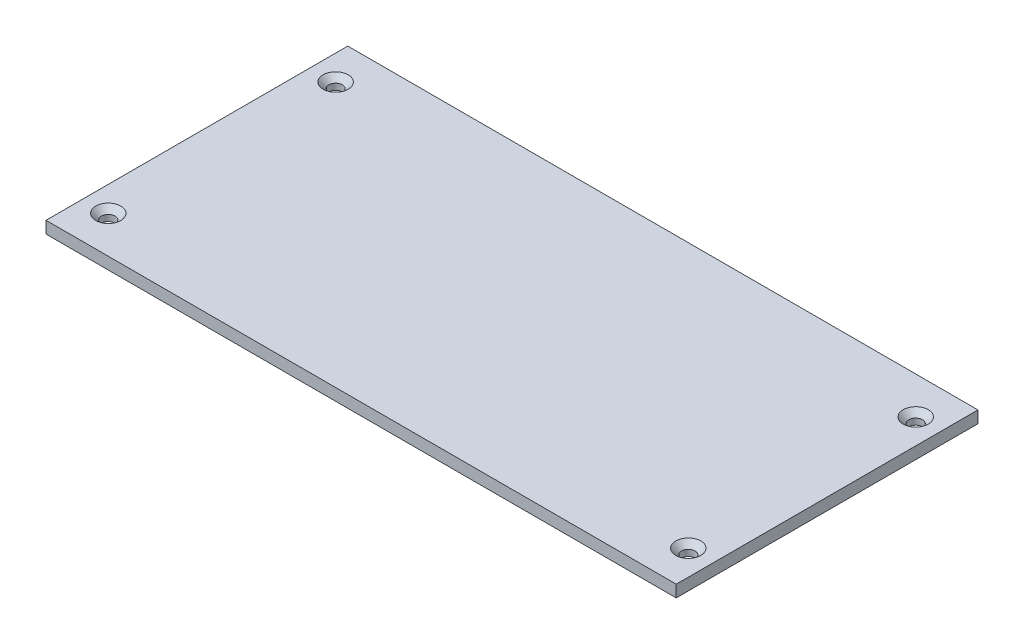
ISO-10303-21;
HEADER;
FILE_DESCRIPTION(('STEP AP214'),'2;1');
FILE_NAME('part.step','',(''),(''),'','','');
FILE_SCHEMA(('AUTOMOTIVE_DESIGN { 1 0 10303 214 1 1 1 1 }'));
ENDSEC;
DATA;
#1=APPLICATION_CONTEXT('core data for automotive mechanical design processes');
#2=APPLICATION_PROTOCOL_DEFINITION('international standard','automotive_design',2000,#1);
#3=PRODUCT_CONTEXT('',#1,'mechanical');
#4=PRODUCT('Part','Part','',(#3));
#5=PRODUCT_RELATED_PRODUCT_CATEGORY('part','',(#4));
#6=PRODUCT_DEFINITION_FORMATION('','',#4);
#7=PRODUCT_DEFINITION_CONTEXT('part definition',#1,'design');
#8=PRODUCT_DEFINITION('design','',#6,#7);
#9=PRODUCT_DEFINITION_SHAPE('','',#8);
#10=(LENGTH_UNIT() NAMED_UNIT(*) SI_UNIT(.MILLI.,.METRE.));
#11=(NAMED_UNIT(*) PLANE_ANGLE_UNIT() SI_UNIT($,.RADIAN.));
#12=(NAMED_UNIT(*) SI_UNIT($,.STERADIAN.) SOLID_ANGLE_UNIT());
#13=UNCERTAINTY_MEASURE_WITH_UNIT(LENGTH_MEASURE(1.E-05),#10,'distance_accuracy_value','');
#14=(GEOMETRIC_REPRESENTATION_CONTEXT(3) GLOBAL_UNCERTAINTY_ASSIGNED_CONTEXT((#13)) GLOBAL_UNIT_ASSIGNED_CONTEXT((#10,
#11,#12)) REPRESENTATION_CONTEXT('',''));
#15=CARTESIAN_POINT('',(0.,0.,0.));
#16=DIRECTION('',(0.,0.,1.));
#17=DIRECTION('',(1.,0.,0.));
#18=AXIS2_PLACEMENT_3D('',#15,#16,#17);
#19=CARTESIAN_POINT('',(-79.200000096,3.,37.925000096));
#20=DIRECTION('',(0.,0.,-1.));
#21=DIRECTION('',(-1.,0.,0.));
#22=AXIS2_PLACEMENT_3D('',#19,#20,#21);
#23=PLANE('',#22);
#24=DIRECTION('',(1.,0.,0.));
#25=VECTOR('',#24,1.);
#26=CARTESIAN_POINT('',(-79.200000096,0.,37.925000096));
#27=LINE('',#26,#25);
#28=CARTESIAN_POINT('',(-79.200000096,0.,37.925000096));
#29=VERTEX_POINT('',#28);
#30=CARTESIAN_POINT('',(79.200000096,0.,37.925000096));
#31=VERTEX_POINT('',#30);
#32=EDGE_CURVE('E107',#29,#31,#27,.T.);
#33=ORIENTED_EDGE('',*,*,#32,.T.);
#34=DIRECTION('',(0.,-1.,0.));
#35=VECTOR('',#34,1.);
#36=CARTESIAN_POINT('',(79.200000096,3.,37.925000096));
#37=LINE('',#36,#35);
#38=CARTESIAN_POINT('',(79.200000096,3.,37.925000096));
#39=VERTEX_POINT('',#38);
#40=EDGE_CURVE('E11',#39,#31,#37,.T.);
#41=ORIENTED_EDGE('',*,*,#40,.F.);
#42=DIRECTION('',(1.,0.,0.));
#43=VECTOR('',#42,1.);
#44=CARTESIAN_POINT('',(-79.200000096,3.,37.925000096));
#45=LINE('',#44,#43);
#46=CARTESIAN_POINT('',(-79.200000096,3.,37.925000096));
#47=VERTEX_POINT('',#46);
#48=EDGE_CURVE('E89',#47,#39,#45,.T.);
#49=ORIENTED_EDGE('',*,*,#48,.F.);
#50=DIRECTION('',(0.,-1.,0.));
#51=VECTOR('',#50,1.);
#52=CARTESIAN_POINT('',(-79.200000096,3.,37.925000096));
#53=LINE('',#52,#51);
#54=EDGE_CURVE('E56',#47,#29,#53,.T.);
#55=ORIENTED_EDGE('',*,*,#54,.T.);
#56=EDGE_LOOP('',(#33,#41,#49,#55));
#57=FACE_BOUND('',#56,.T.);
#58=ADVANCED_FACE('F39',(#57),#23,.F.);
#59=CARTESIAN_POINT('',(79.200000096,3.,37.925000096));
#60=DIRECTION('',(-1.,0.,0.));
#61=DIRECTION('',(0.,0.,1.));
#62=AXIS2_PLACEMENT_3D('',#59,#60,#61);
#63=PLANE('',#62);
#64=DIRECTION('',(0.,0.,-1.));
#65=VECTOR('',#64,1.);
#66=CARTESIAN_POINT('',(79.200000096,0.,37.925000096));
#67=LINE('',#66,#65);
#68=CARTESIAN_POINT('',(79.200000096,0.,-37.925000096));
#69=VERTEX_POINT('',#68);
#70=EDGE_CURVE('E95',#31,#69,#67,.T.);
#71=ORIENTED_EDGE('',*,*,#70,.T.);
#72=DIRECTION('',(0.,-1.,0.));
#73=VECTOR('',#72,1.);
#74=CARTESIAN_POINT('',(79.200000096,3.,-37.925000096));
#75=LINE('',#74,#73);
#76=CARTESIAN_POINT('',(79.200000096,3.,-37.925000096));
#77=VERTEX_POINT('',#76);
#78=EDGE_CURVE('E48',#77,#69,#75,.T.);
#79=ORIENTED_EDGE('',*,*,#78,.F.);
#80=DIRECTION('',(0.,0.,-1.));
#81=VECTOR('',#80,1.);
#82=CARTESIAN_POINT('',(79.200000096,3.,37.925000096));
#83=LINE('',#82,#81);
#84=EDGE_CURVE('E81',#39,#77,#83,.T.);
#85=ORIENTED_EDGE('',*,*,#84,.F.);
#86=ORIENTED_EDGE('',*,*,#40,.T.);
#87=EDGE_LOOP('',(#71,#79,#85,#86));
#88=FACE_BOUND('',#87,.T.);
#89=ADVANCED_FACE('F94',(#88),#63,.F.);
#90=CARTESIAN_POINT('',(-79.200000096,3.,-37.925000096));
#91=DIRECTION('',(0.,0.,-1.));
#92=DIRECTION('',(-1.,0.,0.));
#93=AXIS2_PLACEMENT_3D('',#90,#91,#92);
#94=PLANE('',#93);
#95=DIRECTION('',(1.,0.,0.));
#96=VECTOR('',#95,1.);
#97=CARTESIAN_POINT('',(-79.200000096,0.,-37.925000096));
#98=LINE('',#97,#96);
#99=CARTESIAN_POINT('',(-79.200000096,0.,-37.925000096));
#100=VERTEX_POINT('',#99);
#101=EDGE_CURVE('E113',#100,#69,#98,.T.);
#102=ORIENTED_EDGE('',*,*,#101,.F.);
#103=DIRECTION('',(0.,-1.,0.));
#104=VECTOR('',#103,1.);
#105=CARTESIAN_POINT('',(-79.200000096,3.,-37.925000096));
#106=LINE('',#105,#104);
#107=CARTESIAN_POINT('',(-79.200000096,3.,-37.925000096));
#108=VERTEX_POINT('',#107);
#109=EDGE_CURVE('E70',#108,#100,#106,.T.);
#110=ORIENTED_EDGE('',*,*,#109,.F.);
#111=DIRECTION('',(1.,0.,0.));
#112=VECTOR('',#111,1.);
#113=CARTESIAN_POINT('',(-79.200000096,3.,-37.925000096));
#114=LINE('',#113,#112);
#115=EDGE_CURVE('E88',#108,#77,#114,.T.);
#116=ORIENTED_EDGE('',*,*,#115,.T.);
#117=ORIENTED_EDGE('',*,*,#78,.T.);
#118=EDGE_LOOP('',(#102,#110,#116,#117));
#119=FACE_BOUND('',#118,.T.);
#120=ADVANCED_FACE('F99',(#119),#94,.T.);
#121=CARTESIAN_POINT('',(-79.200000096,3.,37.925000096));
#122=DIRECTION('',(-1.,0.,0.));
#123=DIRECTION('',(0.,0.,1.));
#124=AXIS2_PLACEMENT_3D('',#121,#122,#123);
#125=PLANE('',#124);
#126=DIRECTION('',(0.,0.,-1.));
#127=VECTOR('',#126,1.);
#128=CARTESIAN_POINT('',(-79.200000096,0.,37.925000096));
#129=LINE('',#128,#127);
#130=EDGE_CURVE('E116',#29,#100,#129,.T.);
#131=ORIENTED_EDGE('',*,*,#130,.F.);
#132=ORIENTED_EDGE('',*,*,#54,.F.);
#133=DIRECTION('',(0.,0.,-1.));
#134=VECTOR('',#133,1.);
#135=CARTESIAN_POINT('',(-79.200000096,3.,37.925000096));
#136=LINE('',#135,#134);
#137=EDGE_CURVE('E101',#47,#108,#136,.T.);
#138=ORIENTED_EDGE('',*,*,#137,.T.);
#139=ORIENTED_EDGE('',*,*,#109,.T.);
#140=EDGE_LOOP('',(#131,#132,#138,#139));
#141=FACE_BOUND('',#140,.T.);
#142=ADVANCED_FACE('F179',(#141),#125,.T.);
#143=CARTESIAN_POINT('',(0.,3.,0.));
#144=DIRECTION('',(0.,1.,0.));
#145=DIRECTION('',(0.,0.,1.));
#146=AXIS2_PLACEMENT_3D('',#143,#144,#145);
#147=PLANE('',#146);
#148=CARTESIAN_POINT('',(-72.898,3.,-28.575));
#149=DIRECTION('',(0.,1.,0.));
#150=DIRECTION('',(0.,0.,1.));
#151=AXIS2_PLACEMENT_3D('',#148,#149,#150);
#152=CIRCLE('',#151,3.15);
#153=CARTESIAN_POINT('',(-72.898,3.,-25.425));
#154=VERTEX_POINT('',#153);
#155=EDGE_CURVE('E169',#154,#154,#152,.T.);
#156=ORIENTED_EDGE('',*,*,#155,.F.);
#157=EDGE_LOOP('',(#156));
#158=FACE_BOUND('',#157,.T.);
#159=CARTESIAN_POINT('',(-72.898,3.,28.575));
#160=DIRECTION('',(0.,1.,0.));
#161=DIRECTION('',(0.,0.,1.));
#162=AXIS2_PLACEMENT_3D('',#159,#160,#161);
#163=CIRCLE('',#162,3.15);
#164=CARTESIAN_POINT('',(-72.898,3.,31.725));
#165=VERTEX_POINT('',#164);
#166=EDGE_CURVE('E157',#165,#165,#163,.T.);
#167=ORIENTED_EDGE('',*,*,#166,.F.);
#168=EDGE_LOOP('',(#167));
#169=FACE_BOUND('',#168,.T.);
#170=CARTESIAN_POINT('',(72.898,3.,28.575));
#171=DIRECTION('',(0.,1.,0.));
#172=DIRECTION('',(0.,0.,1.));
#173=AXIS2_PLACEMENT_3D('',#170,#171,#172);
#174=CIRCLE('',#173,3.15);
#175=CARTESIAN_POINT('',(72.898,3.,31.725));
#176=VERTEX_POINT('',#175);
#177=EDGE_CURVE('E145',#176,#176,#174,.T.);
#178=ORIENTED_EDGE('',*,*,#177,.F.);
#179=EDGE_LOOP('',(#178));
#180=FACE_BOUND('',#179,.T.);
#181=CARTESIAN_POINT('',(72.898,3.,-28.575));
#182=DIRECTION('',(0.,1.,0.));
#183=DIRECTION('',(0.,0.,1.));
#184=AXIS2_PLACEMENT_3D('',#181,#182,#183);
#185=CIRCLE('',#184,3.15);
#186=CARTESIAN_POINT('',(72.898,3.,-25.425));
#187=VERTEX_POINT('',#186);
#188=EDGE_CURVE('E133',#187,#187,#185,.T.);
#189=ORIENTED_EDGE('',*,*,#188,.F.);
#190=EDGE_LOOP('',(#189));
#191=FACE_BOUND('',#190,.T.);
#192=ORIENTED_EDGE('',*,*,#48,.T.);
#193=ORIENTED_EDGE('',*,*,#84,.T.);
#194=ORIENTED_EDGE('',*,*,#115,.F.);
#195=ORIENTED_EDGE('',*,*,#137,.F.);
#196=EDGE_LOOP('',(#192,#193,#194,#195));
#197=FACE_BOUND('',#196,.T.);
#198=ADVANCED_FACE('F85',(#158,#169,#180,#191,#197),#147,.T.);
#199=CARTESIAN_POINT('',(0.,0.,0.));
#200=DIRECTION('',(0.,1.,0.));
#201=DIRECTION('',(0.,0.,1.));
#202=AXIS2_PLACEMENT_3D('',#199,#200,#201);
#203=PLANE('',#202);
#204=CARTESIAN_POINT('',(-72.898,0.,-28.575));
#205=DIRECTION('',(0.,1.,0.));
#206=DIRECTION('',(0.,0.,1.));
#207=AXIS2_PLACEMENT_3D('',#204,#205,#206);
#208=CIRCLE('',#207,1.69999999999999);
#209=CARTESIAN_POINT('',(-72.898,0.,-26.875));
#210=VERTEX_POINT('',#209);
#211=EDGE_CURVE('E161',#210,#210,#208,.T.);
#212=ORIENTED_EDGE('',*,*,#211,.T.);
#213=EDGE_LOOP('',(#212));
#214=FACE_BOUND('',#213,.T.);
#215=CARTESIAN_POINT('',(-72.898,0.,28.575));
#216=DIRECTION('',(0.,1.,0.));
#217=DIRECTION('',(0.,0.,1.));
#218=AXIS2_PLACEMENT_3D('',#215,#216,#217);
#219=CIRCLE('',#218,1.69999999999999);
#220=CARTESIAN_POINT('',(-72.898,0.,30.275));
#221=VERTEX_POINT('',#220);
#222=EDGE_CURVE('E149',#221,#221,#219,.T.);
#223=ORIENTED_EDGE('',*,*,#222,.T.);
#224=EDGE_LOOP('',(#223));
#225=FACE_BOUND('',#224,.T.);
#226=CARTESIAN_POINT('',(72.898,0.,28.575));
#227=DIRECTION('',(0.,1.,0.));
#228=DIRECTION('',(0.,0.,1.));
#229=AXIS2_PLACEMENT_3D('',#226,#227,#228);
#230=CIRCLE('',#229,1.69999999999999);
#231=CARTESIAN_POINT('',(72.898,0.,30.275));
#232=VERTEX_POINT('',#231);
#233=EDGE_CURVE('E137',#232,#232,#230,.T.);
#234=ORIENTED_EDGE('',*,*,#233,.T.);
#235=EDGE_LOOP('',(#234));
#236=FACE_BOUND('',#235,.T.);
#237=CARTESIAN_POINT('',(72.898,0.,-28.575));
#238=DIRECTION('',(0.,1.,0.));
#239=DIRECTION('',(0.,0.,1.));
#240=AXIS2_PLACEMENT_3D('',#237,#238,#239);
#241=CIRCLE('',#240,1.69999999999999);
#242=CARTESIAN_POINT('',(72.898,0.,-26.875));
#243=VERTEX_POINT('',#242);
#244=EDGE_CURVE('E110',#243,#243,#241,.T.);
#245=ORIENTED_EDGE('',*,*,#244,.T.);
#246=EDGE_LOOP('',(#245));
#247=FACE_BOUND('',#246,.T.);
#248=ORIENTED_EDGE('',*,*,#32,.F.);
#249=ORIENTED_EDGE('',*,*,#130,.T.);
#250=ORIENTED_EDGE('',*,*,#101,.T.);
#251=ORIENTED_EDGE('',*,*,#70,.F.);
#252=EDGE_LOOP('',(#248,#249,#250,#251));
#253=FACE_BOUND('',#252,.T.);
#254=ADVANCED_FACE('F178',(#214,#225,#236,#247,#253),#203,.F.);
#255=CARTESIAN_POINT('',(72.898,3.,-28.575));
#256=DIRECTION('',(0.,1.,0.));
#257=DIRECTION('',(0.,0.,1.));
#258=AXIS2_PLACEMENT_3D('',#255,#256,#257);
#259=CYLINDRICAL_SURFACE('',#258,1.69999999999999);
#260=ORIENTED_EDGE('',*,*,#244,.F.);
#261=EDGE_LOOP('',(#260));
#262=FACE_BOUND('',#261,.T.);
#263=CARTESIAN_POINT('',(72.898,1.54999999999999,-28.575));
#264=DIRECTION('',(0.,1.,0.));
#265=DIRECTION('',(0.,0.,1.));
#266=AXIS2_PLACEMENT_3D('',#263,#264,#265);
#267=CIRCLE('',#266,1.69999999999999);
#268=CARTESIAN_POINT('',(72.898,1.54999999999999,-26.875));
#269=VERTEX_POINT('',#268);
#270=EDGE_CURVE('E129',#269,#269,#267,.T.);
#271=ORIENTED_EDGE('',*,*,#270,.T.);
#272=EDGE_LOOP('',(#271));
#273=FACE_BOUND('',#272,.T.);
#274=ADVANCED_FACE('F190',(#262,#273),#259,.F.);
#275=CARTESIAN_POINT('',(72.898,3.,-28.575));
#276=DIRECTION('',(0.,1.,0.));
#277=DIRECTION('',(0.,0.,1.));
#278=AXIS2_PLACEMENT_3D('',#275,#276,#277);
#279=CONICAL_SURFACE('',#278,3.15,0.785398163397448);
#280=ORIENTED_EDGE('',*,*,#270,.F.);
#281=EDGE_LOOP('',(#280));
#282=FACE_BOUND('',#281,.T.);
#283=ORIENTED_EDGE('',*,*,#188,.T.);
#284=EDGE_LOOP('',(#283));
#285=FACE_BOUND('',#284,.T.);
#286=ADVANCED_FACE('F187',(#282,#285),#279,.F.);
#287=CARTESIAN_POINT('',(72.898,3.,28.575));
#288=DIRECTION('',(0.,1.,0.));
#289=DIRECTION('',(0.,0.,1.));
#290=AXIS2_PLACEMENT_3D('',#287,#288,#289);
#291=CYLINDRICAL_SURFACE('',#290,1.69999999999999);
#292=ORIENTED_EDGE('',*,*,#233,.F.);
#293=EDGE_LOOP('',(#292));
#294=FACE_BOUND('',#293,.T.);
#295=CARTESIAN_POINT('',(72.898,1.54999999999999,28.575));
#296=DIRECTION('',(0.,1.,0.));
#297=DIRECTION('',(0.,0.,1.));
#298=AXIS2_PLACEMENT_3D('',#295,#296,#297);
#299=CIRCLE('',#298,1.69999999999999);
#300=CARTESIAN_POINT('',(72.898,1.54999999999999,30.275));
#301=VERTEX_POINT('',#300);
#302=EDGE_CURVE('E141',#301,#301,#299,.T.);
#303=ORIENTED_EDGE('',*,*,#302,.T.);
#304=EDGE_LOOP('',(#303));
#305=FACE_BOUND('',#304,.T.);
#306=ADVANCED_FACE('F189',(#294,#305),#291,.F.);
#307=CARTESIAN_POINT('',(72.898,3.,28.575));
#308=DIRECTION('',(0.,1.,0.));
#309=DIRECTION('',(0.,0.,1.));
#310=AXIS2_PLACEMENT_3D('',#307,#308,#309);
#311=CONICAL_SURFACE('',#310,3.15,0.785398163397448);
#312=ORIENTED_EDGE('',*,*,#302,.F.);
#313=EDGE_LOOP('',(#312));
#314=FACE_BOUND('',#313,.T.);
#315=ORIENTED_EDGE('',*,*,#177,.T.);
#316=EDGE_LOOP('',(#315));
#317=FACE_BOUND('',#316,.T.);
#318=ADVANCED_FACE('F197',(#314,#317),#311,.F.);
#319=CARTESIAN_POINT('',(-72.898,3.,28.575));
#320=DIRECTION('',(0.,1.,0.));
#321=DIRECTION('',(0.,0.,1.));
#322=AXIS2_PLACEMENT_3D('',#319,#320,#321);
#323=CYLINDRICAL_SURFACE('',#322,1.69999999999999);
#324=ORIENTED_EDGE('',*,*,#222,.F.);
#325=EDGE_LOOP('',(#324));
#326=FACE_BOUND('',#325,.T.);
#327=CARTESIAN_POINT('',(-72.898,1.54999999999999,28.575));
#328=DIRECTION('',(0.,1.,0.));
#329=DIRECTION('',(0.,0.,1.));
#330=AXIS2_PLACEMENT_3D('',#327,#328,#329);
#331=CIRCLE('',#330,1.69999999999999);
#332=CARTESIAN_POINT('',(-72.898,1.54999999999999,30.275));
#333=VERTEX_POINT('',#332);
#334=EDGE_CURVE('E153',#333,#333,#331,.T.);
#335=ORIENTED_EDGE('',*,*,#334,.T.);
#336=EDGE_LOOP('',(#335));
#337=FACE_BOUND('',#336,.T.);
#338=ADVANCED_FACE('F231',(#326,#337),#323,.F.);
#339=CARTESIAN_POINT('',(-72.898,3.,28.575));
#340=DIRECTION('',(0.,1.,0.));
#341=DIRECTION('',(0.,0.,1.));
#342=AXIS2_PLACEMENT_3D('',#339,#340,#341);
#343=CONICAL_SURFACE('',#342,3.15,0.785398163397448);
#344=ORIENTED_EDGE('',*,*,#334,.F.);
#345=EDGE_LOOP('',(#344));
#346=FACE_BOUND('',#345,.T.);
#347=ORIENTED_EDGE('',*,*,#166,.T.);
#348=EDGE_LOOP('',(#347));
#349=FACE_BOUND('',#348,.T.);
#350=ADVANCED_FACE('F236',(#346,#349),#343,.F.);
#351=CARTESIAN_POINT('',(-72.898,3.,-28.575));
#352=DIRECTION('',(0.,1.,0.));
#353=DIRECTION('',(0.,0.,1.));
#354=AXIS2_PLACEMENT_3D('',#351,#352,#353);
#355=CYLINDRICAL_SURFACE('',#354,1.69999999999999);
#356=ORIENTED_EDGE('',*,*,#211,.F.);
#357=EDGE_LOOP('',(#356));
#358=FACE_BOUND('',#357,.T.);
#359=CARTESIAN_POINT('',(-72.898,1.54999999999999,-28.575));
#360=DIRECTION('',(0.,1.,0.));
#361=DIRECTION('',(0.,0.,1.));
#362=AXIS2_PLACEMENT_3D('',#359,#360,#361);
#363=CIRCLE('',#362,1.69999999999999);
#364=CARTESIAN_POINT('',(-72.898,1.54999999999999,-26.875));
#365=VERTEX_POINT('',#364);
#366=EDGE_CURVE('E165',#365,#365,#363,.T.);
#367=ORIENTED_EDGE('',*,*,#366,.T.);
#368=EDGE_LOOP('',(#367));
#369=FACE_BOUND('',#368,.T.);
#370=ADVANCED_FACE('F242',(#358,#369),#355,.F.);
#371=CARTESIAN_POINT('',(-72.898,3.,-28.575));
#372=DIRECTION('',(0.,1.,0.));
#373=DIRECTION('',(0.,0.,1.));
#374=AXIS2_PLACEMENT_3D('',#371,#372,#373);
#375=CONICAL_SURFACE('',#374,3.15,0.785398163397448);
#376=ORIENTED_EDGE('',*,*,#366,.F.);
#377=EDGE_LOOP('',(#376));
#378=FACE_BOUND('',#377,.T.);
#379=ORIENTED_EDGE('',*,*,#155,.T.);
#380=EDGE_LOOP('',(#379));
#381=FACE_BOUND('',#380,.T.);
#382=ADVANCED_FACE('F174',(#378,#381),#375,.F.);
#383=CLOSED_SHELL('',(#58,#89,#120,#142,#198,#254,#274,#286,#306,#318,#338,#350,#370,#382));
#384=MANIFOLD_SOLID_BREP('B2',#383);
#385=ADVANCED_BREP_SHAPE_REPRESENTATION('',(#18,#384),#14);
#386=SHAPE_DEFINITION_REPRESENTATION(#9,#385);
ENDSEC;
END-ISO-10303-21;
